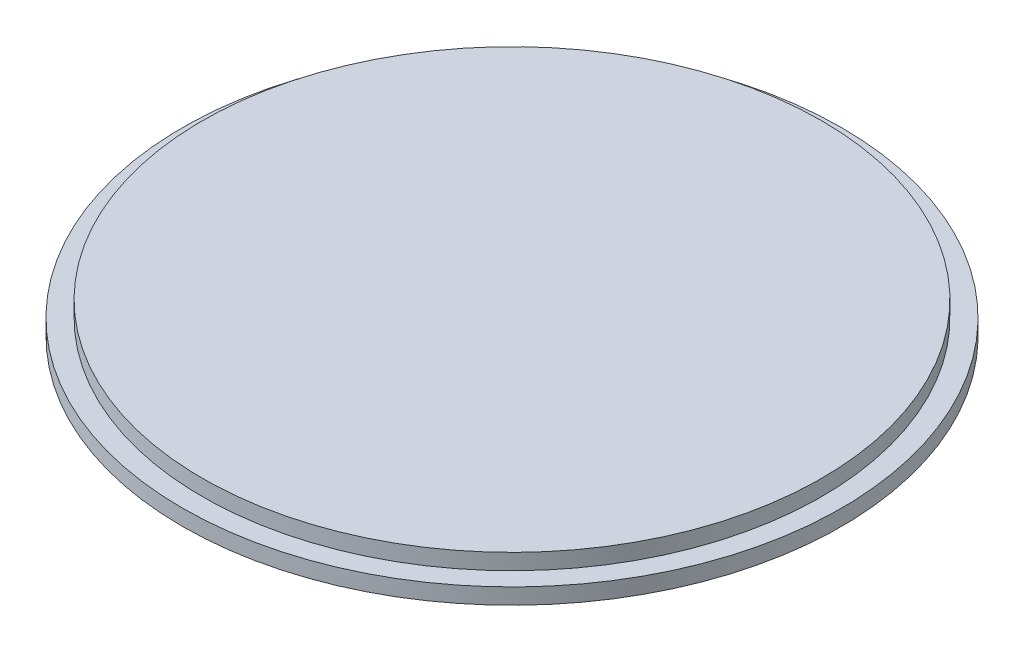
ISO-10303-21;
HEADER;
FILE_DESCRIPTION(('STEP AP214'),'2;1');
FILE_NAME('part.step','',(''),(''),'','','');
FILE_SCHEMA(('AUTOMOTIVE_DESIGN { 1 0 10303 214 1 1 1 1 }'));
ENDSEC;
DATA;
#1=APPLICATION_CONTEXT('core data for automotive mechanical design processes');
#2=APPLICATION_PROTOCOL_DEFINITION('international standard','automotive_design',2000,#1);
#3=PRODUCT_CONTEXT('',#1,'mechanical');
#4=PRODUCT('Part','Part','',(#3));
#5=PRODUCT_RELATED_PRODUCT_CATEGORY('part','',(#4));
#6=PRODUCT_DEFINITION_FORMATION('','',#4);
#7=PRODUCT_DEFINITION_CONTEXT('part definition',#1,'design');
#8=PRODUCT_DEFINITION('design','',#6,#7);
#9=PRODUCT_DEFINITION_SHAPE('','',#8);
#10=(LENGTH_UNIT() NAMED_UNIT(*) SI_UNIT(.MILLI.,.METRE.));
#11=(NAMED_UNIT(*) PLANE_ANGLE_UNIT() SI_UNIT($,.RADIAN.));
#12=(NAMED_UNIT(*) SI_UNIT($,.STERADIAN.) SOLID_ANGLE_UNIT());
#13=UNCERTAINTY_MEASURE_WITH_UNIT(LENGTH_MEASURE(1.E-05),#10,'distance_accuracy_value','');
#14=(GEOMETRIC_REPRESENTATION_CONTEXT(3) GLOBAL_UNCERTAINTY_ASSIGNED_CONTEXT((#13)) GLOBAL_UNIT_ASSIGNED_CONTEXT((#10,
#11,#12)) REPRESENTATION_CONTEXT('',''));
#15=CARTESIAN_POINT('',(0.,0.,0.));
#16=DIRECTION('',(0.,0.,1.));
#17=DIRECTION('',(1.,0.,0.));
#18=AXIS2_PLACEMENT_3D('',#15,#16,#17);
#19=CARTESIAN_POINT('',(0.,2.38125,0.));
#20=DIRECTION('',(0.,-1.,0.));
#21=DIRECTION('',(0.,0.,-1.));
#22=AXIS2_PLACEMENT_3D('',#19,#20,#21);
#23=CYLINDRICAL_SURFACE('',#22,49.403);
#24=CARTESIAN_POINT('',(0.,2.38125,0.));
#25=DIRECTION('',(0.,1.,0.));
#26=DIRECTION('',(0.,0.,1.));
#27=AXIS2_PLACEMENT_3D('',#24,#25,#26);
#28=CIRCLE('',#27,49.403);
#29=CARTESIAN_POINT('',(0.,2.38125,-49.403));
#30=VERTEX_POINT('',#29);
#31=EDGE_CURVE('E40',#30,#30,#28,.T.);
#32=CARTESIAN_POINT('',(0.,0.,0.));
#33=DIRECTION('',(0.,1.,0.));
#34=DIRECTION('',(0.,0.,1.));
#35=AXIS2_PLACEMENT_3D('',#32,#33,#34);
#36=CIRCLE('',#35,49.403);
#37=CARTESIAN_POINT('',(0.,0.,-49.403));
#38=VERTEX_POINT('',#37);
#39=EDGE_CURVE('E36',#38,#38,#36,.T.);
#40=CARTESIAN_POINT('',(0.,2.38125,-49.403));
#41=CARTESIAN_POINT('',(0.,2.3564453125,-49.403));
#42=CARTESIAN_POINT('',(0.,2.331640625,-49.403));
#43=CARTESIAN_POINT('',(0.,2.28203125,-49.403));
#44=CARTESIAN_POINT('',(0.,2.2572265625,-49.403));
#45=CARTESIAN_POINT('',(0.,2.2076171875,-49.403));
#46=CARTESIAN_POINT('',(0.,2.1828125,-49.403));
#47=CARTESIAN_POINT('',(0.,2.133203125,-49.403));
#48=CARTESIAN_POINT('',(0.,2.1083984375,-49.403));
#49=CARTESIAN_POINT('',(0.,2.0587890625,-49.403));
#50=CARTESIAN_POINT('',(0.,2.033984375,-49.403));
#51=CARTESIAN_POINT('',(0.,1.984375,-49.403));
#52=CARTESIAN_POINT('',(0.,1.9595703125,-49.403));
#53=CARTESIAN_POINT('',(0.,1.9099609375,-49.403));
#54=CARTESIAN_POINT('',(0.,1.88515625,-49.403));
#55=CARTESIAN_POINT('',(0.,1.835546875,-49.403));
#56=CARTESIAN_POINT('',(0.,1.8107421875,-49.403));
#57=CARTESIAN_POINT('',(0.,1.7611328125,-49.403));
#58=CARTESIAN_POINT('',(0.,1.736328125,-49.403));
#59=CARTESIAN_POINT('',(0.,1.68671875,-49.403));
#60=CARTESIAN_POINT('',(0.,1.6619140625,-49.403));
#61=CARTESIAN_POINT('',(0.,1.6123046875,-49.403));
#62=CARTESIAN_POINT('',(0.,1.5875,-49.403));
#63=CARTESIAN_POINT('',(0.,1.537890625,-49.403));
#64=CARTESIAN_POINT('',(0.,1.5130859375,-49.403));
#65=CARTESIAN_POINT('',(0.,1.4634765625,-49.403));
#66=CARTESIAN_POINT('',(0.,1.438671875,-49.403));
#67=CARTESIAN_POINT('',(0.,1.3890625,-49.403));
#68=CARTESIAN_POINT('',(0.,1.3642578125,-49.403));
#69=CARTESIAN_POINT('',(0.,1.3146484375,-49.403));
#70=CARTESIAN_POINT('',(0.,1.28984375,-49.403));
#71=CARTESIAN_POINT('',(0.,1.240234375,-49.403));
#72=CARTESIAN_POINT('',(0.,1.2154296875,-49.403));
#73=CARTESIAN_POINT('',(0.,1.1658203125,-49.403));
#74=CARTESIAN_POINT('',(0.,1.141015625,-49.403));
#75=CARTESIAN_POINT('',(0.,1.09140625,-49.403));
#76=CARTESIAN_POINT('',(0.,1.0666015625,-49.403));
#77=CARTESIAN_POINT('',(0.,1.0169921875,-49.403));
#78=CARTESIAN_POINT('',(0.,0.9921875,-49.403));
#79=CARTESIAN_POINT('',(0.,0.942578125,-49.403));
#80=CARTESIAN_POINT('',(0.,0.9177734375,-49.403));
#81=CARTESIAN_POINT('',(0.,0.8681640625,-49.403));
#82=CARTESIAN_POINT('',(0.,0.843359375,-49.403));
#83=CARTESIAN_POINT('',(0.,0.79375,-49.403));
#84=CARTESIAN_POINT('',(0.,0.7689453125,-49.403));
#85=CARTESIAN_POINT('',(0.,0.7193359375,-49.403));
#86=CARTESIAN_POINT('',(0.,0.69453125,-49.403));
#87=CARTESIAN_POINT('',(0.,0.644921875,-49.403));
#88=CARTESIAN_POINT('',(0.,0.6201171875,-49.403));
#89=CARTESIAN_POINT('',(0.,0.5705078125,-49.403));
#90=CARTESIAN_POINT('',(0.,0.545703125,-49.403));
#91=CARTESIAN_POINT('',(0.,0.49609375,-49.403));
#92=CARTESIAN_POINT('',(0.,0.4712890625,-49.403));
#93=CARTESIAN_POINT('',(0.,0.4216796875,-49.403));
#94=CARTESIAN_POINT('',(0.,0.396875,-49.403));
#95=CARTESIAN_POINT('',(0.,0.347265625,-49.403));
#96=CARTESIAN_POINT('',(0.,0.3224609375,-49.403));
#97=CARTESIAN_POINT('',(0.,0.2728515625,-49.403));
#98=CARTESIAN_POINT('',(0.,0.248046875,-49.403));
#99=CARTESIAN_POINT('',(0.,0.1984375,-49.403));
#100=CARTESIAN_POINT('',(0.,0.1736328125,-49.403));
#101=CARTESIAN_POINT('',(0.,0.1240234375,-49.403));
#102=CARTESIAN_POINT('',(0.,0.0992187500000001,-49.403));
#103=CARTESIAN_POINT('',(0.,0.049609375,-49.403));
#104=CARTESIAN_POINT('',(0.,0.0248046875,-49.403));
#105=CARTESIAN_POINT('',(0.,0.,-49.403));
#106=B_SPLINE_CURVE_WITH_KNOTS('',3,(#40,#41,#42,#43,#44,#45,#46,#47,#48,#49,#50,#51,#52,#53,
#54,#55,#56,#57,#58,#59,#60,#61,#62,#63,#64,#65,#66,#67,#68,#69,#70,#71,#72,#73,#74,#75,#76,#77,
#78,#79,#80,#81,#82,#83,#84,#85,#86,#87,#88,#89,#90,#91,#92,#93,#94,#95,#96,#97,#98,#99,#100,
#101,#102,#103,#104,#105),.UNSPECIFIED.,.F.,.F.,(4,2,2,2,2,2,2,2,2,2,2,2,2,2,2,2,2,2,2,2,2,2,2,
2,2,2,2,2,2,2,2,2,4),(0.,0.0744140625,0.148828125,0.2232421875,0.29765625,0.3720703125,
0.446484375,0.5208984375,0.5953125,0.6697265625,0.744140625,0.8185546875,0.89296875,
0.9673828125,1.041796875,1.1162109375,1.190625,1.2650390625,1.339453125,1.4138671875,1.48828125,
1.5626953125,1.637109375,1.7115234375,1.7859375,1.8603515625,1.934765625,2.0091796875,
2.08359375,2.1580078125,2.232421875,2.3068359375,2.38125),.UNSPECIFIED.);
#107=EDGE_CURVE('BSEAM33',#30,#38,#106,.T.);
#108=ORIENTED_EDGE('',*,*,#31,.F.);
#109=ORIENTED_EDGE('',*,*,#39,.T.);
#110=ORIENTED_EDGE('',*,*,#107,.T.);
#111=ORIENTED_EDGE('',*,*,#107,.F.);
#112=EDGE_LOOP('',(#108,#110,#109,#111));
#113=FACE_BOUND('',#112,.T.);
#114=ADVANCED_FACE('F33',(#113),#23,.T.);
#115=CARTESIAN_POINT('',(0.,2.38125,0.));
#116=DIRECTION('',(0.,1.,0.));
#117=DIRECTION('',(0.,0.,1.));
#118=AXIS2_PLACEMENT_3D('',#115,#116,#117);
#119=PLANE('',#118);
#120=CARTESIAN_POINT('',(0.,2.38125,0.));
#121=DIRECTION('',(0.,1.,0.));
#122=DIRECTION('',(0.,0.,1.));
#123=AXIS2_PLACEMENT_3D('',#120,#121,#122);
#124=CIRCLE('',#123,46.42485);
#125=CARTESIAN_POINT('',(0.,2.38125,-46.42485));
#126=VERTEX_POINT('',#125);
#127=EDGE_CURVE('E10',#126,#126,#124,.T.);
#128=ORIENTED_EDGE('',*,*,#127,.F.);
#129=EDGE_LOOP('',(#128));
#130=FACE_BOUND('',#129,.T.);
#131=ORIENTED_EDGE('',*,*,#31,.T.);
#132=EDGE_LOOP('',(#131));
#133=FACE_BOUND('',#132,.T.);
#134=ADVANCED_FACE('F57',(#130,#133),#119,.T.);
#135=CARTESIAN_POINT('',(0.,0.,0.));
#136=DIRECTION('',(0.,1.,0.));
#137=DIRECTION('',(0.,0.,1.));
#138=AXIS2_PLACEMENT_3D('',#135,#136,#137);
#139=PLANE('',#138);
#140=ORIENTED_EDGE('',*,*,#39,.F.);
#141=EDGE_LOOP('',(#140));
#142=FACE_BOUND('',#141,.T.);
#143=ADVANCED_FACE('F54',(#142),#139,.F.);
#144=CARTESIAN_POINT('',(0.,4.7625,0.));
#145=DIRECTION('',(0.,-1.,0.));
#146=DIRECTION('',(0.,0.,-1.));
#147=AXIS2_PLACEMENT_3D('',#144,#145,#146);
#148=CYLINDRICAL_SURFACE('',#147,46.42485);
#149=CARTESIAN_POINT('',(0.,4.7625,0.));
#150=DIRECTION('',(0.,1.,0.));
#151=DIRECTION('',(0.,0.,1.));
#152=AXIS2_PLACEMENT_3D('',#149,#150,#151);
#153=CIRCLE('',#152,46.42485);
#154=CARTESIAN_POINT('',(0.,4.7625,-46.42485));
#155=VERTEX_POINT('',#154);
#156=EDGE_CURVE('E46',#155,#155,#153,.T.);
#157=CARTESIAN_POINT('',(0.,4.7625,-46.42485));
#158=CARTESIAN_POINT('',(0.,4.7376953125,-46.42485));
#159=CARTESIAN_POINT('',(0.,4.712890625,-46.42485));
#160=CARTESIAN_POINT('',(0.,4.66328125,-46.42485));
#161=CARTESIAN_POINT('',(0.,4.6384765625,-46.42485));
#162=CARTESIAN_POINT('',(0.,4.5888671875,-46.42485));
#163=CARTESIAN_POINT('',(0.,4.5640625,-46.42485));
#164=CARTESIAN_POINT('',(0.,4.514453125,-46.42485));
#165=CARTESIAN_POINT('',(0.,4.4896484375,-46.42485));
#166=CARTESIAN_POINT('',(0.,4.4400390625,-46.42485));
#167=CARTESIAN_POINT('',(0.,4.415234375,-46.42485));
#168=CARTESIAN_POINT('',(0.,4.365625,-46.42485));
#169=CARTESIAN_POINT('',(0.,4.3408203125,-46.42485));
#170=CARTESIAN_POINT('',(0.,4.2912109375,-46.42485));
#171=CARTESIAN_POINT('',(0.,4.26640625,-46.42485));
#172=CARTESIAN_POINT('',(0.,4.216796875,-46.42485));
#173=CARTESIAN_POINT('',(0.,4.1919921875,-46.42485));
#174=CARTESIAN_POINT('',(0.,4.1423828125,-46.42485));
#175=CARTESIAN_POINT('',(0.,4.117578125,-46.42485));
#176=CARTESIAN_POINT('',(0.,4.06796875,-46.42485));
#177=CARTESIAN_POINT('',(0.,4.0431640625,-46.42485));
#178=CARTESIAN_POINT('',(0.,3.9935546875,-46.42485));
#179=CARTESIAN_POINT('',(0.,3.96875,-46.42485));
#180=CARTESIAN_POINT('',(0.,3.919140625,-46.42485));
#181=CARTESIAN_POINT('',(0.,3.8943359375,-46.42485));
#182=CARTESIAN_POINT('',(0.,3.8447265625,-46.42485));
#183=CARTESIAN_POINT('',(0.,3.819921875,-46.42485));
#184=CARTESIAN_POINT('',(0.,3.7703125,-46.42485));
#185=CARTESIAN_POINT('',(0.,3.7455078125,-46.42485));
#186=CARTESIAN_POINT('',(0.,3.6958984375,-46.42485));
#187=CARTESIAN_POINT('',(0.,3.67109375,-46.42485));
#188=CARTESIAN_POINT('',(0.,3.621484375,-46.42485));
#189=CARTESIAN_POINT('',(0.,3.5966796875,-46.42485));
#190=CARTESIAN_POINT('',(0.,3.5470703125,-46.42485));
#191=CARTESIAN_POINT('',(0.,3.522265625,-46.42485));
#192=CARTESIAN_POINT('',(0.,3.47265625,-46.42485));
#193=CARTESIAN_POINT('',(0.,3.4478515625,-46.42485));
#194=CARTESIAN_POINT('',(0.,3.3982421875,-46.42485));
#195=CARTESIAN_POINT('',(0.,3.3734375,-46.42485));
#196=CARTESIAN_POINT('',(0.,3.323828125,-46.42485));
#197=CARTESIAN_POINT('',(0.,3.2990234375,-46.42485));
#198=CARTESIAN_POINT('',(0.,3.2494140625,-46.42485));
#199=CARTESIAN_POINT('',(0.,3.224609375,-46.42485));
#200=CARTESIAN_POINT('',(0.,3.175,-46.42485));
#201=CARTESIAN_POINT('',(0.,3.1501953125,-46.42485));
#202=CARTESIAN_POINT('',(0.,3.1005859375,-46.42485));
#203=CARTESIAN_POINT('',(0.,3.07578125,-46.42485));
#204=CARTESIAN_POINT('',(0.,3.026171875,-46.42485));
#205=CARTESIAN_POINT('',(0.,3.0013671875,-46.42485));
#206=CARTESIAN_POINT('',(0.,2.9517578125,-46.42485));
#207=CARTESIAN_POINT('',(0.,2.926953125,-46.42485));
#208=CARTESIAN_POINT('',(0.,2.87734375,-46.42485));
#209=CARTESIAN_POINT('',(0.,2.8525390625,-46.42485));
#210=CARTESIAN_POINT('',(0.,2.8029296875,-46.42485));
#211=CARTESIAN_POINT('',(0.,2.778125,-46.42485));
#212=CARTESIAN_POINT('',(0.,2.728515625,-46.42485));
#213=CARTESIAN_POINT('',(0.,2.7037109375,-46.42485));
#214=CARTESIAN_POINT('',(0.,2.6541015625,-46.42485));
#215=CARTESIAN_POINT('',(0.,2.629296875,-46.42485));
#216=CARTESIAN_POINT('',(0.,2.5796875,-46.42485));
#217=CARTESIAN_POINT('',(0.,2.5548828125,-46.42485));
#218=CARTESIAN_POINT('',(0.,2.5052734375,-46.42485));
#219=CARTESIAN_POINT('',(0.,2.48046875,-46.42485));
#220=CARTESIAN_POINT('',(0.,2.430859375,-46.42485));
#221=CARTESIAN_POINT('',(0.,2.4060546875,-46.42485));
#222=CARTESIAN_POINT('',(0.,2.38125,-46.42485));
#223=B_SPLINE_CURVE_WITH_KNOTS('',3,(#157,#158,#159,#160,#161,#162,#163,#164,#165,#166,#167,
#168,#169,#170,#171,#172,#173,#174,#175,#176,#177,#178,#179,#180,#181,#182,#183,#184,#185,#186,
#187,#188,#189,#190,#191,#192,#193,#194,#195,#196,#197,#198,#199,#200,#201,#202,#203,#204,#205,
#206,#207,#208,#209,#210,#211,#212,#213,#214,#215,#216,#217,#218,#219,#220,#221,#222),
.UNSPECIFIED.,.F.,.F.,(4,2,2,2,2,2,2,2,2,2,2,2,2,2,2,2,2,2,2,2,2,2,2,2,2,2,2,2,2,2,2,2,4),(0.,
0.0744140624999992,0.148828124999999,0.223242187499999,0.297656249999999,0.372070312499999,
0.446484374999999,0.520898437499999,0.595312499999999,0.6697265625,0.744140625,0.8185546875,
0.89296875,0.9673828125,1.041796875,1.1162109375,1.190625,1.2650390625,1.339453125,1.4138671875,
1.48828125,1.5626953125,1.637109375,1.7115234375,1.7859375,1.8603515625,1.934765625,
2.0091796875,2.08359375,2.1580078125,2.232421875,2.3068359375,2.38125),.UNSPECIFIED.);
#224=EDGE_CURVE('BSEAM56',#155,#126,#223,.T.);
#225=ORIENTED_EDGE('',*,*,#156,.F.);
#226=ORIENTED_EDGE('',*,*,#127,.T.);
#227=ORIENTED_EDGE('',*,*,#224,.T.);
#228=ORIENTED_EDGE('',*,*,#224,.F.);
#229=EDGE_LOOP('',(#225,#227,#226,#228));
#230=FACE_BOUND('',#229,.T.);
#231=ADVANCED_FACE('F56',(#230),#148,.T.);
#232=CARTESIAN_POINT('',(0.,4.7625,0.));
#233=DIRECTION('',(0.,1.,0.));
#234=DIRECTION('',(0.,0.,1.));
#235=AXIS2_PLACEMENT_3D('',#232,#233,#234);
#236=PLANE('',#235);
#237=ORIENTED_EDGE('',*,*,#156,.T.);
#238=EDGE_LOOP('',(#237));
#239=FACE_BOUND('',#238,.T.);
#240=ADVANCED_FACE('F62',(#239),#236,.T.);
#241=CLOSED_SHELL('',(#114,#134,#143,#231,#240));
#242=MANIFOLD_SOLID_BREP('B2',#241);
#243=ADVANCED_BREP_SHAPE_REPRESENTATION('',(#18,#242),#14);
#244=SHAPE_DEFINITION_REPRESENTATION(#9,#243);
ENDSEC;
END-ISO-10303-21;
